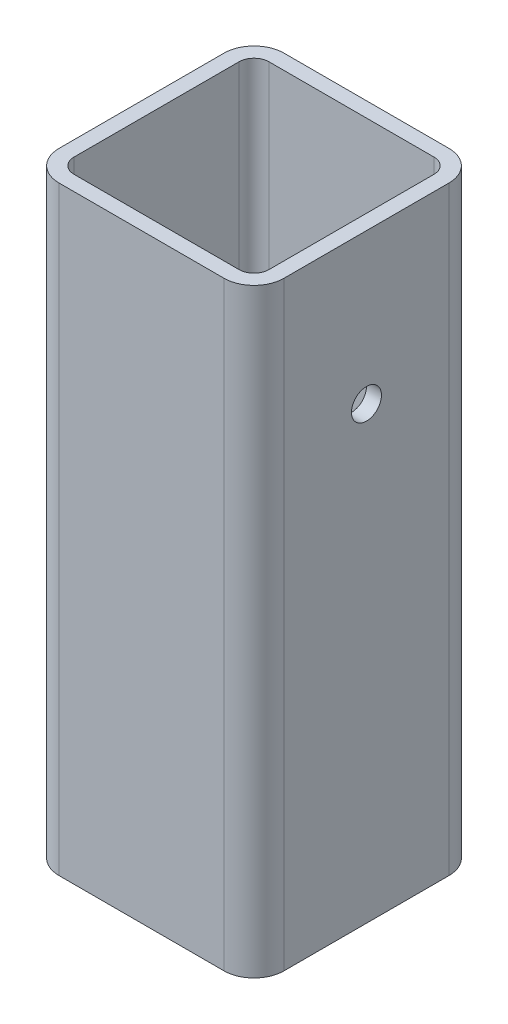
ISO-10303-21;
HEADER;
FILE_DESCRIPTION(('STEP AP214'),'2;1');
FILE_NAME('part.step','',(''),(''),'','','');
FILE_SCHEMA(('AUTOMOTIVE_DESIGN { 1 0 10303 214 1 1 1 1 }'));
ENDSEC;
DATA;
#1=APPLICATION_CONTEXT('core data for automotive mechanical design processes');
#2=APPLICATION_PROTOCOL_DEFINITION('international standard','automotive_design',2000,#1);
#3=PRODUCT_CONTEXT('',#1,'mechanical');
#4=PRODUCT('Part','Part','',(#3));
#5=PRODUCT_RELATED_PRODUCT_CATEGORY('part','',(#4));
#6=PRODUCT_DEFINITION_FORMATION('','',#4);
#7=PRODUCT_DEFINITION_CONTEXT('part definition',#1,'design');
#8=PRODUCT_DEFINITION('design','',#6,#7);
#9=PRODUCT_DEFINITION_SHAPE('','',#8);
#10=(LENGTH_UNIT() NAMED_UNIT(*) SI_UNIT(.MILLI.,.METRE.));
#11=(NAMED_UNIT(*) PLANE_ANGLE_UNIT() SI_UNIT($,.RADIAN.));
#12=(NAMED_UNIT(*) SI_UNIT($,.STERADIAN.) SOLID_ANGLE_UNIT());
#13=UNCERTAINTY_MEASURE_WITH_UNIT(LENGTH_MEASURE(1.E-05),#10,'distance_accuracy_value','');
#14=(GEOMETRIC_REPRESENTATION_CONTEXT(3) GLOBAL_UNCERTAINTY_ASSIGNED_CONTEXT((#13)) GLOBAL_UNIT_ASSIGNED_CONTEXT((#10,
#11,#12)) REPRESENTATION_CONTEXT('',''));
#15=CARTESIAN_POINT('',(0.,0.,0.));
#16=DIRECTION('',(0.,0.,1.));
#17=DIRECTION('',(1.,0.,0.));
#18=AXIS2_PLACEMENT_3D('',#15,#16,#17);
#19=CARTESIAN_POINT('',(-11.,40.,11.));
#20=DIRECTION('',(0.,-1.,0.));
#21=DIRECTION('',(0.,0.,-1.));
#22=AXIS2_PLACEMENT_3D('',#19,#20,#21);
#23=PLANE('',#22);
#24=CARTESIAN_POINT('',(-11.,40.,11.));
#25=DIRECTION('',(0.,1.,0.));
#26=DIRECTION('',(0.,0.,-1.));
#27=AXIS2_PLACEMENT_3D('',#24,#25,#26);
#28=CIRCLE('',#27,4.);
#29=CARTESIAN_POINT('',(-15.,40.,11.));
#30=VERTEX_POINT('',#29);
#31=CARTESIAN_POINT('',(-11.,40.,15.));
#32=VERTEX_POINT('',#31);
#33=EDGE_CURVE('E216',#30,#32,#28,.T.);
#34=ORIENTED_EDGE('',*,*,#33,.T.);
#35=DIRECTION('',(1.,0.,0.));
#36=VECTOR('',#35,1.);
#37=CARTESIAN_POINT('',(-11.,40.,15.));
#38=LINE('',#37,#36);
#39=CARTESIAN_POINT('',(11.,40.,15.));
#40=VERTEX_POINT('',#39);
#41=EDGE_CURVE('E219',#32,#40,#38,.T.);
#42=ORIENTED_EDGE('',*,*,#41,.T.);
#43=CARTESIAN_POINT('',(11.,40.,11.));
#44=DIRECTION('',(0.,1.,0.));
#45=DIRECTION('',(0.,0.,1.));
#46=AXIS2_PLACEMENT_3D('',#43,#44,#45);
#47=CIRCLE('',#46,4.);
#48=CARTESIAN_POINT('',(15.,40.,11.));
#49=VERTEX_POINT('',#48);
#50=EDGE_CURVE('E222',#40,#49,#47,.T.);
#51=ORIENTED_EDGE('',*,*,#50,.T.);
#52=DIRECTION('',(0.,0.,-1.));
#53=VECTOR('',#52,1.);
#54=CARTESIAN_POINT('',(15.,40.,11.));
#55=LINE('',#54,#53);
#56=CARTESIAN_POINT('',(15.,40.,-11.));
#57=VERTEX_POINT('',#56);
#58=EDGE_CURVE('E224',#49,#57,#55,.T.);
#59=ORIENTED_EDGE('',*,*,#58,.T.);
#60=CARTESIAN_POINT('',(11.,40.,-11.));
#61=DIRECTION('',(0.,1.,0.));
#62=DIRECTION('',(0.,0.,-1.));
#63=AXIS2_PLACEMENT_3D('',#60,#61,#62);
#64=CIRCLE('',#63,4.);
#65=CARTESIAN_POINT('',(11.,40.,-15.));
#66=VERTEX_POINT('',#65);
#67=EDGE_CURVE('E226',#57,#66,#64,.T.);
#68=ORIENTED_EDGE('',*,*,#67,.T.);
#69=DIRECTION('',(-1.,0.,0.));
#70=VECTOR('',#69,1.);
#71=CARTESIAN_POINT('',(-11.,40.,-15.));
#72=LINE('',#71,#70);
#73=CARTESIAN_POINT('',(-11.,40.,-15.));
#74=VERTEX_POINT('',#73);
#75=EDGE_CURVE('E228',#66,#74,#72,.T.);
#76=ORIENTED_EDGE('',*,*,#75,.T.);
#77=CARTESIAN_POINT('',(-11.,40.,-11.));
#78=DIRECTION('',(0.,1.,0.));
#79=DIRECTION('',(0.,0.,-1.));
#80=AXIS2_PLACEMENT_3D('',#77,#78,#79);
#81=CIRCLE('',#80,4.);
#82=CARTESIAN_POINT('',(-15.,40.,-11.));
#83=VERTEX_POINT('',#82);
#84=EDGE_CURVE('E230',#74,#83,#81,.T.);
#85=ORIENTED_EDGE('',*,*,#84,.T.);
#86=DIRECTION('',(0.,0.,1.));
#87=VECTOR('',#86,1.);
#88=CARTESIAN_POINT('',(-15.,40.,11.));
#89=LINE('',#88,#87);
#90=EDGE_CURVE('E232',#83,#30,#89,.T.);
#91=ORIENTED_EDGE('',*,*,#90,.T.);
#92=EDGE_LOOP('',(#34,#42,#51,#59,#68,#76,#85,#91));
#93=FACE_BOUND('',#92,.T.);
#94=CARTESIAN_POINT('',(-11.,40.,11.));
#95=DIRECTION('',(0.,1.,0.));
#96=DIRECTION('',(0.,0.,-1.));
#97=AXIS2_PLACEMENT_3D('',#94,#95,#96);
#98=CIRCLE('',#97,2.);
#99=CARTESIAN_POINT('',(-13.,40.,11.));
#100=VERTEX_POINT('',#99);
#101=CARTESIAN_POINT('',(-11.,40.,13.));
#102=VERTEX_POINT('',#101);
#103=EDGE_CURVE('E149',#100,#102,#98,.T.);
#104=ORIENTED_EDGE('',*,*,#103,.F.);
#105=DIRECTION('',(0.,0.,1.));
#106=VECTOR('',#105,1.);
#107=CARTESIAN_POINT('',(-13.,40.,11.));
#108=LINE('',#107,#106);
#109=CARTESIAN_POINT('',(-13.,40.,-11.));
#110=VERTEX_POINT('',#109);
#111=EDGE_CURVE('E183',#110,#100,#108,.T.);
#112=ORIENTED_EDGE('',*,*,#111,.F.);
#113=CARTESIAN_POINT('',(-11.,40.,-11.));
#114=DIRECTION('',(0.,1.,0.));
#115=DIRECTION('',(0.,0.,-1.));
#116=AXIS2_PLACEMENT_3D('',#113,#114,#115);
#117=CIRCLE('',#116,2.);
#118=CARTESIAN_POINT('',(-11.,40.,-13.));
#119=VERTEX_POINT('',#118);
#120=EDGE_CURVE('E181',#119,#110,#117,.T.);
#121=ORIENTED_EDGE('',*,*,#120,.F.);
#122=DIRECTION('',(-1.,0.,0.));
#123=VECTOR('',#122,1.);
#124=CARTESIAN_POINT('',(-11.,40.,-13.));
#125=LINE('',#124,#123);
#126=CARTESIAN_POINT('',(11.,40.,-13.));
#127=VERTEX_POINT('',#126);
#128=EDGE_CURVE('E179',#127,#119,#125,.T.);
#129=ORIENTED_EDGE('',*,*,#128,.F.);
#130=CARTESIAN_POINT('',(11.,40.,-11.));
#131=DIRECTION('',(0.,1.,0.));
#132=DIRECTION('',(0.,0.,-1.));
#133=AXIS2_PLACEMENT_3D('',#130,#131,#132);
#134=CIRCLE('',#133,2.);
#135=CARTESIAN_POINT('',(13.,40.,-11.));
#136=VERTEX_POINT('',#135);
#137=EDGE_CURVE('E177',#136,#127,#134,.T.);
#138=ORIENTED_EDGE('',*,*,#137,.F.);
#139=DIRECTION('',(0.,0.,-1.));
#140=VECTOR('',#139,1.);
#141=CARTESIAN_POINT('',(13.,40.,11.));
#142=LINE('',#141,#140);
#143=CARTESIAN_POINT('',(13.,40.,11.));
#144=VERTEX_POINT('',#143);
#145=EDGE_CURVE('E172',#144,#136,#142,.T.);
#146=ORIENTED_EDGE('',*,*,#145,.F.);
#147=CARTESIAN_POINT('',(11.,40.,11.));
#148=DIRECTION('',(0.,1.,0.));
#149=DIRECTION('',(0.,0.,1.));
#150=AXIS2_PLACEMENT_3D('',#147,#148,#149);
#151=CIRCLE('',#150,2.);
#152=CARTESIAN_POINT('',(11.,40.,13.));
#153=VERTEX_POINT('',#152);
#154=EDGE_CURVE('E170',#153,#144,#151,.T.);
#155=ORIENTED_EDGE('',*,*,#154,.F.);
#156=DIRECTION('',(1.,0.,0.));
#157=VECTOR('',#156,1.);
#158=CARTESIAN_POINT('',(-11.,40.,13.));
#159=LINE('',#158,#157);
#160=EDGE_CURVE('E157',#102,#153,#159,.T.);
#161=ORIENTED_EDGE('',*,*,#160,.F.);
#162=EDGE_LOOP('',(#104,#112,#121,#129,#138,#146,#155,#161));
#163=FACE_BOUND('',#162,.T.);
#164=ADVANCED_FACE('F35',(#93,#163),#23,.F.);
#165=CARTESIAN_POINT('',(-11.,-40.,11.));
#166=DIRECTION('',(0.,-1.,0.));
#167=DIRECTION('',(0.,0.,-1.));
#168=AXIS2_PLACEMENT_3D('',#165,#166,#167);
#169=PLANE('',#168);
#170=CARTESIAN_POINT('',(-11.,-40.,11.));
#171=DIRECTION('',(0.,1.,0.));
#172=DIRECTION('',(0.,0.,-1.));
#173=AXIS2_PLACEMENT_3D('',#170,#171,#172);
#174=CIRCLE('',#173,4.);
#175=CARTESIAN_POINT('',(-15.,-40.,11.));
#176=VERTEX_POINT('',#175);
#177=CARTESIAN_POINT('',(-11.,-40.,15.));
#178=VERTEX_POINT('',#177);
#179=EDGE_CURVE('E165',#176,#178,#174,.T.);
#180=ORIENTED_EDGE('',*,*,#179,.F.);
#181=DIRECTION('',(0.,0.,1.));
#182=VECTOR('',#181,1.);
#183=CARTESIAN_POINT('',(-15.,-40.,11.));
#184=LINE('',#183,#182);
#185=CARTESIAN_POINT('',(-15.,-40.,-11.));
#186=VERTEX_POINT('',#185);
#187=EDGE_CURVE('E220',#186,#176,#184,.T.);
#188=ORIENTED_EDGE('',*,*,#187,.F.);
#189=CARTESIAN_POINT('',(-11.,-40.,-11.));
#190=DIRECTION('',(0.,1.,0.));
#191=DIRECTION('',(0.,0.,-1.));
#192=AXIS2_PLACEMENT_3D('',#189,#190,#191);
#193=CIRCLE('',#192,4.);
#194=CARTESIAN_POINT('',(-11.,-40.,-15.));
#195=VERTEX_POINT('',#194);
#196=EDGE_CURVE('E247',#195,#186,#193,.T.);
#197=ORIENTED_EDGE('',*,*,#196,.F.);
#198=DIRECTION('',(-1.,0.,0.));
#199=VECTOR('',#198,1.);
#200=CARTESIAN_POINT('',(-11.,-40.,-15.));
#201=LINE('',#200,#199);
#202=CARTESIAN_POINT('',(11.,-40.,-15.));
#203=VERTEX_POINT('',#202);
#204=EDGE_CURVE('E245',#203,#195,#201,.T.);
#205=ORIENTED_EDGE('',*,*,#204,.F.);
#206=CARTESIAN_POINT('',(11.,-40.,-11.));
#207=DIRECTION('',(0.,1.,0.));
#208=DIRECTION('',(0.,0.,-1.));
#209=AXIS2_PLACEMENT_3D('',#206,#207,#208);
#210=CIRCLE('',#209,4.);
#211=CARTESIAN_POINT('',(15.,-40.,-11.));
#212=VERTEX_POINT('',#211);
#213=EDGE_CURVE('E243',#212,#203,#210,.T.);
#214=ORIENTED_EDGE('',*,*,#213,.F.);
#215=DIRECTION('',(0.,0.,-1.));
#216=VECTOR('',#215,1.);
#217=CARTESIAN_POINT('',(15.,-40.,11.));
#218=LINE('',#217,#216);
#219=CARTESIAN_POINT('',(15.,-40.,11.));
#220=VERTEX_POINT('',#219);
#221=EDGE_CURVE('E241',#220,#212,#218,.T.);
#222=ORIENTED_EDGE('',*,*,#221,.F.);
#223=CARTESIAN_POINT('',(11.,-40.,11.));
#224=DIRECTION('',(0.,1.,0.));
#225=DIRECTION('',(0.,0.,1.));
#226=AXIS2_PLACEMENT_3D('',#223,#224,#225);
#227=CIRCLE('',#226,4.);
#228=CARTESIAN_POINT('',(11.,-40.,15.));
#229=VERTEX_POINT('',#228);
#230=EDGE_CURVE('E239',#229,#220,#227,.T.);
#231=ORIENTED_EDGE('',*,*,#230,.F.);
#232=DIRECTION('',(1.,0.,0.));
#233=VECTOR('',#232,1.);
#234=CARTESIAN_POINT('',(-11.,-40.,15.));
#235=LINE('',#234,#233);
#236=EDGE_CURVE('E237',#178,#229,#235,.T.);
#237=ORIENTED_EDGE('',*,*,#236,.F.);
#238=EDGE_LOOP('',(#180,#188,#197,#205,#214,#222,#231,#237));
#239=FACE_BOUND('',#238,.T.);
#240=DIRECTION('',(0.,0.,1.));
#241=VECTOR('',#240,1.);
#242=CARTESIAN_POINT('',(-13.,-40.,11.));
#243=LINE('',#242,#241);
#244=CARTESIAN_POINT('',(-13.,-40.,-11.));
#245=VERTEX_POINT('',#244);
#246=CARTESIAN_POINT('',(-13.,-40.,11.));
#247=VERTEX_POINT('',#246);
#248=EDGE_CURVE('E158',#245,#247,#243,.T.);
#249=ORIENTED_EDGE('',*,*,#248,.T.);
#250=CARTESIAN_POINT('',(-11.,-40.,11.));
#251=DIRECTION('',(0.,1.,0.));
#252=DIRECTION('',(0.,0.,-1.));
#253=AXIS2_PLACEMENT_3D('',#250,#251,#252);
#254=CIRCLE('',#253,2.);
#255=CARTESIAN_POINT('',(-11.,-40.,13.));
#256=VERTEX_POINT('',#255);
#257=EDGE_CURVE('E59',#247,#256,#254,.T.);
#258=ORIENTED_EDGE('',*,*,#257,.T.);
#259=DIRECTION('',(1.,0.,0.));
#260=VECTOR('',#259,1.);
#261=CARTESIAN_POINT('',(-11.,-40.,13.));
#262=LINE('',#261,#260);
#263=CARTESIAN_POINT('',(11.,-40.,13.));
#264=VERTEX_POINT('',#263);
#265=EDGE_CURVE('E164',#256,#264,#262,.T.);
#266=ORIENTED_EDGE('',*,*,#265,.T.);
#267=CARTESIAN_POINT('',(11.,-40.,11.));
#268=DIRECTION('',(0.,1.,0.));
#269=DIRECTION('',(0.,0.,1.));
#270=AXIS2_PLACEMENT_3D('',#267,#268,#269);
#271=CIRCLE('',#270,2.);
#272=CARTESIAN_POINT('',(13.,-40.,11.));
#273=VERTEX_POINT('',#272);
#274=EDGE_CURVE('E188',#264,#273,#271,.T.);
#275=ORIENTED_EDGE('',*,*,#274,.T.);
#276=DIRECTION('',(0.,0.,-1.));
#277=VECTOR('',#276,1.);
#278=CARTESIAN_POINT('',(13.,-40.,11.));
#279=LINE('',#278,#277);
#280=CARTESIAN_POINT('',(13.,-40.,-11.));
#281=VERTEX_POINT('',#280);
#282=EDGE_CURVE('E191',#273,#281,#279,.T.);
#283=ORIENTED_EDGE('',*,*,#282,.T.);
#284=CARTESIAN_POINT('',(11.,-40.,-11.));
#285=DIRECTION('',(0.,1.,0.));
#286=DIRECTION('',(0.,0.,-1.));
#287=AXIS2_PLACEMENT_3D('',#284,#285,#286);
#288=CIRCLE('',#287,2.);
#289=CARTESIAN_POINT('',(11.,-40.,-13.));
#290=VERTEX_POINT('',#289);
#291=EDGE_CURVE('E194',#281,#290,#288,.T.);
#292=ORIENTED_EDGE('',*,*,#291,.T.);
#293=DIRECTION('',(-1.,0.,0.));
#294=VECTOR('',#293,1.);
#295=CARTESIAN_POINT('',(-11.,-40.,-13.));
#296=LINE('',#295,#294);
#297=CARTESIAN_POINT('',(-11.,-40.,-13.));
#298=VERTEX_POINT('',#297);
#299=EDGE_CURVE('E197',#290,#298,#296,.T.);
#300=ORIENTED_EDGE('',*,*,#299,.T.);
#301=CARTESIAN_POINT('',(-11.,-40.,-11.));
#302=DIRECTION('',(0.,1.,0.));
#303=DIRECTION('',(0.,0.,-1.));
#304=AXIS2_PLACEMENT_3D('',#301,#302,#303);
#305=CIRCLE('',#304,2.);
#306=EDGE_CURVE('E200',#298,#245,#305,.T.);
#307=ORIENTED_EDGE('',*,*,#306,.T.);
#308=EDGE_LOOP('',(#249,#258,#266,#275,#283,#292,#300,#307));
#309=FACE_BOUND('',#308,.T.);
#310=ADVANCED_FACE('F278',(#239,#309),#169,.T.);
#311=CARTESIAN_POINT('',(-11.,40.,11.));
#312=DIRECTION('',(0.,-1.,0.));
#313=DIRECTION('',(0.,0.,-1.));
#314=AXIS2_PLACEMENT_3D('',#311,#312,#313);
#315=CYLINDRICAL_SURFACE('',#314,4.);
#316=ORIENTED_EDGE('',*,*,#179,.T.);
#317=DIRECTION('',(0.,-1.,0.));
#318=VECTOR('',#317,1.);
#319=CARTESIAN_POINT('',(-11.,40.,15.));
#320=LINE('',#319,#318);
#321=EDGE_CURVE('E11',#32,#178,#320,.T.);
#322=ORIENTED_EDGE('',*,*,#321,.F.);
#323=ORIENTED_EDGE('',*,*,#33,.F.);
#324=DIRECTION('',(0.,-1.,0.));
#325=VECTOR('',#324,1.);
#326=CARTESIAN_POINT('',(-15.,40.,11.));
#327=LINE('',#326,#325);
#328=EDGE_CURVE('E234',#30,#176,#327,.T.);
#329=ORIENTED_EDGE('',*,*,#328,.T.);
#330=EDGE_LOOP('',(#316,#322,#323,#329));
#331=FACE_BOUND('',#330,.T.);
#332=ADVANCED_FACE('F37',(#331),#315,.T.);
#333=CARTESIAN_POINT('',(-11.,40.,15.));
#334=DIRECTION('',(0.,0.,-1.));
#335=DIRECTION('',(-1.,0.,0.));
#336=AXIS2_PLACEMENT_3D('',#333,#334,#335);
#337=PLANE('',#336);
#338=ORIENTED_EDGE('',*,*,#236,.T.);
#339=DIRECTION('',(0.,-1.,0.));
#340=VECTOR('',#339,1.);
#341=CARTESIAN_POINT('',(11.,40.,15.));
#342=LINE('',#341,#340);
#343=EDGE_CURVE('E44',#40,#229,#342,.T.);
#344=ORIENTED_EDGE('',*,*,#343,.F.);
#345=ORIENTED_EDGE('',*,*,#41,.F.);
#346=ORIENTED_EDGE('',*,*,#321,.T.);
#347=EDGE_LOOP('',(#338,#344,#345,#346));
#348=FACE_BOUND('',#347,.T.);
#349=ADVANCED_FACE('F295',(#348),#337,.F.);
#350=CARTESIAN_POINT('',(11.,40.,11.));
#351=DIRECTION('',(0.,-1.,0.));
#352=DIRECTION('',(0.,0.,-1.));
#353=AXIS2_PLACEMENT_3D('',#350,#351,#352);
#354=CYLINDRICAL_SURFACE('',#353,4.);
#355=ORIENTED_EDGE('',*,*,#230,.T.);
#356=DIRECTION('',(0.,-1.,0.));
#357=VECTOR('',#356,1.);
#358=CARTESIAN_POINT('',(15.,40.,11.));
#359=LINE('',#358,#357);
#360=EDGE_CURVE('E264',#49,#220,#359,.T.);
#361=ORIENTED_EDGE('',*,*,#360,.F.);
#362=ORIENTED_EDGE('',*,*,#50,.F.);
#363=ORIENTED_EDGE('',*,*,#343,.T.);
#364=EDGE_LOOP('',(#355,#361,#362,#363));
#365=FACE_BOUND('',#364,.T.);
#366=ADVANCED_FACE('F272',(#365),#354,.T.);
#367=CARTESIAN_POINT('',(15.,40.,11.));
#368=DIRECTION('',(-1.,0.,0.));
#369=DIRECTION('',(0.,0.,1.));
#370=AXIS2_PLACEMENT_3D('',#367,#368,#369);
#371=PLANE('',#370);
#372=CARTESIAN_POINT('',(15.,20.,0.));
#373=DIRECTION('',(1.,0.,0.));
#374=DIRECTION('',(0.,0.,-1.));
#375=AXIS2_PLACEMENT_3D('',#372,#373,#374);
#376=CIRCLE('',#375,2.);
#377=CARTESIAN_POINT('',(15.,20.,-2.));
#378=VERTEX_POINT('',#377);
#379=EDGE_CURVE('E335',#378,#378,#376,.T.);
#380=ORIENTED_EDGE('',*,*,#379,.F.);
#381=EDGE_LOOP('',(#380));
#382=FACE_BOUND('',#381,.T.);
#383=ORIENTED_EDGE('',*,*,#221,.T.);
#384=DIRECTION('',(0.,-1.,0.));
#385=VECTOR('',#384,1.);
#386=CARTESIAN_POINT('',(15.,40.,-11.));
#387=LINE('',#386,#385);
#388=EDGE_CURVE('E261',#57,#212,#387,.T.);
#389=ORIENTED_EDGE('',*,*,#388,.F.);
#390=ORIENTED_EDGE('',*,*,#58,.F.);
#391=ORIENTED_EDGE('',*,*,#360,.T.);
#392=EDGE_LOOP('',(#383,#389,#390,#391));
#393=FACE_BOUND('',#392,.T.);
#394=ADVANCED_FACE('F284',(#382,#393),#371,.F.);
#395=CARTESIAN_POINT('',(11.,40.,-11.));
#396=DIRECTION('',(0.,-1.,0.));
#397=DIRECTION('',(0.,0.,-1.));
#398=AXIS2_PLACEMENT_3D('',#395,#396,#397);
#399=CYLINDRICAL_SURFACE('',#398,4.);
#400=ORIENTED_EDGE('',*,*,#213,.T.);
#401=DIRECTION('',(0.,-1.,0.));
#402=VECTOR('',#401,1.);
#403=CARTESIAN_POINT('',(11.,40.,-15.));
#404=LINE('',#403,#402);
#405=EDGE_CURVE('E258',#66,#203,#404,.T.);
#406=ORIENTED_EDGE('',*,*,#405,.F.);
#407=ORIENTED_EDGE('',*,*,#67,.F.);
#408=ORIENTED_EDGE('',*,*,#388,.T.);
#409=EDGE_LOOP('',(#400,#406,#407,#408));
#410=FACE_BOUND('',#409,.T.);
#411=ADVANCED_FACE('F288',(#410),#399,.T.);
#412=CARTESIAN_POINT('',(-11.,40.,-15.));
#413=DIRECTION('',(0.,0.,1.));
#414=DIRECTION('',(1.,0.,0.));
#415=AXIS2_PLACEMENT_3D('',#412,#413,#414);
#416=PLANE('',#415);
#417=ORIENTED_EDGE('',*,*,#204,.T.);
#418=DIRECTION('',(0.,-1.,0.));
#419=VECTOR('',#418,1.);
#420=CARTESIAN_POINT('',(-11.,40.,-15.));
#421=LINE('',#420,#419);
#422=EDGE_CURVE('E255',#74,#195,#421,.T.);
#423=ORIENTED_EDGE('',*,*,#422,.F.);
#424=ORIENTED_EDGE('',*,*,#75,.F.);
#425=ORIENTED_EDGE('',*,*,#405,.T.);
#426=EDGE_LOOP('',(#417,#423,#424,#425));
#427=FACE_BOUND('',#426,.T.);
#428=ADVANCED_FACE('F308',(#427),#416,.F.);
#429=CARTESIAN_POINT('',(-11.,40.,-11.));
#430=DIRECTION('',(0.,-1.,0.));
#431=DIRECTION('',(0.,0.,-1.));
#432=AXIS2_PLACEMENT_3D('',#429,#430,#431);
#433=CYLINDRICAL_SURFACE('',#432,4.);
#434=ORIENTED_EDGE('',*,*,#196,.T.);
#435=DIRECTION('',(0.,-1.,0.));
#436=VECTOR('',#435,1.);
#437=CARTESIAN_POINT('',(-15.,40.,-11.));
#438=LINE('',#437,#436);
#439=EDGE_CURVE('E252',#83,#186,#438,.T.);
#440=ORIENTED_EDGE('',*,*,#439,.F.);
#441=ORIENTED_EDGE('',*,*,#84,.F.);
#442=ORIENTED_EDGE('',*,*,#422,.T.);
#443=EDGE_LOOP('',(#434,#440,#441,#442));
#444=FACE_BOUND('',#443,.T.);
#445=ADVANCED_FACE('F306',(#444),#433,.T.);
#446=CARTESIAN_POINT('',(-15.,40.,11.));
#447=DIRECTION('',(1.,0.,0.));
#448=DIRECTION('',(0.,0.,-1.));
#449=AXIS2_PLACEMENT_3D('',#446,#447,#448);
#450=PLANE('',#449);
#451=CARTESIAN_POINT('',(-15.,20.,0.));
#452=DIRECTION('',(1.,0.,0.));
#453=DIRECTION('',(0.,0.,-1.));
#454=AXIS2_PLACEMENT_3D('',#451,#452,#453);
#455=CIRCLE('',#454,2.);
#456=CARTESIAN_POINT('',(-15.,20.,-2.));
#457=VERTEX_POINT('',#456);
#458=EDGE_CURVE('E333',#457,#457,#455,.T.);
#459=ORIENTED_EDGE('',*,*,#458,.T.);
#460=EDGE_LOOP('',(#459));
#461=FACE_BOUND('',#460,.T.);
#462=ORIENTED_EDGE('',*,*,#187,.T.);
#463=ORIENTED_EDGE('',*,*,#328,.F.);
#464=ORIENTED_EDGE('',*,*,#90,.F.);
#465=ORIENTED_EDGE('',*,*,#439,.T.);
#466=EDGE_LOOP('',(#462,#463,#464,#465));
#467=FACE_BOUND('',#466,.T.);
#468=ADVANCED_FACE('F301',(#461,#467),#450,.F.);
#469=CARTESIAN_POINT('',(-11.,40.,11.));
#470=DIRECTION('',(0.,-1.,0.));
#471=DIRECTION('',(0.,0.,-1.));
#472=AXIS2_PLACEMENT_3D('',#469,#470,#471);
#473=CYLINDRICAL_SURFACE('',#472,2.);
#474=ORIENTED_EDGE('',*,*,#257,.F.);
#475=DIRECTION('',(0.,-1.,0.));
#476=VECTOR('',#475,1.);
#477=CARTESIAN_POINT('',(-13.,40.,11.));
#478=LINE('',#477,#476);
#479=EDGE_CURVE('E153',#100,#247,#478,.T.);
#480=ORIENTED_EDGE('',*,*,#479,.F.);
#481=ORIENTED_EDGE('',*,*,#103,.T.);
#482=DIRECTION('',(0.,-1.,0.));
#483=VECTOR('',#482,1.);
#484=CARTESIAN_POINT('',(-11.,40.,13.));
#485=LINE('',#484,#483);
#486=EDGE_CURVE('E152',#102,#256,#485,.T.);
#487=ORIENTED_EDGE('',*,*,#486,.T.);
#488=EDGE_LOOP('',(#474,#480,#481,#487));
#489=FACE_BOUND('',#488,.T.);
#490=ADVANCED_FACE('F151',(#489),#473,.F.);
#491=CARTESIAN_POINT('',(-11.,40.,13.));
#492=DIRECTION('',(0.,0.,-1.));
#493=DIRECTION('',(-1.,0.,0.));
#494=AXIS2_PLACEMENT_3D('',#491,#492,#493);
#495=PLANE('',#494);
#496=ORIENTED_EDGE('',*,*,#265,.F.);
#497=ORIENTED_EDGE('',*,*,#486,.F.);
#498=ORIENTED_EDGE('',*,*,#160,.T.);
#499=DIRECTION('',(0.,-1.,0.));
#500=VECTOR('',#499,1.);
#501=CARTESIAN_POINT('',(11.,40.,13.));
#502=LINE('',#501,#500);
#503=EDGE_CURVE('E166',#153,#264,#502,.T.);
#504=ORIENTED_EDGE('',*,*,#503,.T.);
#505=EDGE_LOOP('',(#496,#497,#498,#504));
#506=FACE_BOUND('',#505,.T.);
#507=ADVANCED_FACE('F161',(#506),#495,.T.);
#508=CARTESIAN_POINT('',(11.,40.,11.));
#509=DIRECTION('',(0.,-1.,0.));
#510=DIRECTION('',(0.,0.,-1.));
#511=AXIS2_PLACEMENT_3D('',#508,#509,#510);
#512=CYLINDRICAL_SURFACE('',#511,2.);
#513=ORIENTED_EDGE('',*,*,#274,.F.);
#514=ORIENTED_EDGE('',*,*,#503,.F.);
#515=ORIENTED_EDGE('',*,*,#154,.T.);
#516=DIRECTION('',(0.,-1.,0.));
#517=VECTOR('',#516,1.);
#518=CARTESIAN_POINT('',(13.,40.,11.));
#519=LINE('',#518,#517);
#520=EDGE_CURVE('E213',#144,#273,#519,.T.);
#521=ORIENTED_EDGE('',*,*,#520,.T.);
#522=EDGE_LOOP('',(#513,#514,#515,#521));
#523=FACE_BOUND('',#522,.T.);
#524=ADVANCED_FACE('F350',(#523),#512,.F.);
#525=CARTESIAN_POINT('',(13.,40.,11.));
#526=DIRECTION('',(-1.,0.,0.));
#527=DIRECTION('',(0.,0.,1.));
#528=AXIS2_PLACEMENT_3D('',#525,#526,#527);
#529=PLANE('',#528);
#530=CARTESIAN_POINT('',(13.,20.,0.));
#531=DIRECTION('',(-1.,0.,0.));
#532=DIRECTION('',(0.,0.,1.));
#533=AXIS2_PLACEMENT_3D('',#530,#531,#532);
#534=CIRCLE('',#533,2.);
#535=CARTESIAN_POINT('',(13.,20.,2.));
#536=VERTEX_POINT('',#535);
#537=EDGE_CURVE('E186',#536,#536,#534,.T.);
#538=ORIENTED_EDGE('',*,*,#537,.F.);
#539=EDGE_LOOP('',(#538));
#540=FACE_BOUND('',#539,.T.);
#541=ORIENTED_EDGE('',*,*,#282,.F.);
#542=ORIENTED_EDGE('',*,*,#520,.F.);
#543=ORIENTED_EDGE('',*,*,#145,.T.);
#544=DIRECTION('',(0.,-1.,0.));
#545=VECTOR('',#544,1.);
#546=CARTESIAN_POINT('',(13.,40.,-11.));
#547=LINE('',#546,#545);
#548=EDGE_CURVE('E211',#136,#281,#547,.T.);
#549=ORIENTED_EDGE('',*,*,#548,.T.);
#550=EDGE_LOOP('',(#541,#542,#543,#549));
#551=FACE_BOUND('',#550,.T.);
#552=ADVANCED_FACE('F346',(#540,#551),#529,.T.);
#553=CARTESIAN_POINT('',(11.,40.,-11.));
#554=DIRECTION('',(0.,-1.,0.));
#555=DIRECTION('',(0.,0.,-1.));
#556=AXIS2_PLACEMENT_3D('',#553,#554,#555);
#557=CYLINDRICAL_SURFACE('',#556,2.);
#558=ORIENTED_EDGE('',*,*,#291,.F.);
#559=ORIENTED_EDGE('',*,*,#548,.F.);
#560=ORIENTED_EDGE('',*,*,#137,.T.);
#561=DIRECTION('',(0.,-1.,0.));
#562=VECTOR('',#561,1.);
#563=CARTESIAN_POINT('',(11.,40.,-13.));
#564=LINE('',#563,#562);
#565=EDGE_CURVE('E209',#127,#290,#564,.T.);
#566=ORIENTED_EDGE('',*,*,#565,.T.);
#567=EDGE_LOOP('',(#558,#559,#560,#566));
#568=FACE_BOUND('',#567,.T.);
#569=ADVANCED_FACE('F349',(#568),#557,.F.);
#570=CARTESIAN_POINT('',(-11.,40.,-13.));
#571=DIRECTION('',(0.,0.,1.));
#572=DIRECTION('',(1.,0.,0.));
#573=AXIS2_PLACEMENT_3D('',#570,#571,#572);
#574=PLANE('',#573);
#575=ORIENTED_EDGE('',*,*,#299,.F.);
#576=ORIENTED_EDGE('',*,*,#565,.F.);
#577=ORIENTED_EDGE('',*,*,#128,.T.);
#578=DIRECTION('',(0.,-1.,0.));
#579=VECTOR('',#578,1.);
#580=CARTESIAN_POINT('',(-11.,40.,-13.));
#581=LINE('',#580,#579);
#582=EDGE_CURVE('E207',#119,#298,#581,.T.);
#583=ORIENTED_EDGE('',*,*,#582,.T.);
#584=EDGE_LOOP('',(#575,#576,#577,#583));
#585=FACE_BOUND('',#584,.T.);
#586=ADVANCED_FACE('F366',(#585),#574,.T.);
#587=CARTESIAN_POINT('',(-11.,40.,-11.));
#588=DIRECTION('',(0.,-1.,0.));
#589=DIRECTION('',(0.,0.,-1.));
#590=AXIS2_PLACEMENT_3D('',#587,#588,#589);
#591=CYLINDRICAL_SURFACE('',#590,2.);
#592=ORIENTED_EDGE('',*,*,#306,.F.);
#593=ORIENTED_EDGE('',*,*,#582,.F.);
#594=ORIENTED_EDGE('',*,*,#120,.T.);
#595=DIRECTION('',(0.,-1.,0.));
#596=VECTOR('',#595,1.);
#597=CARTESIAN_POINT('',(-13.,40.,-11.));
#598=LINE('',#597,#596);
#599=EDGE_CURVE('E51',#110,#245,#598,.T.);
#600=ORIENTED_EDGE('',*,*,#599,.T.);
#601=EDGE_LOOP('',(#592,#593,#594,#600));
#602=FACE_BOUND('',#601,.T.);
#603=ADVANCED_FACE('F370',(#602),#591,.F.);
#604=CARTESIAN_POINT('',(-13.,40.,11.));
#605=DIRECTION('',(1.,0.,0.));
#606=DIRECTION('',(0.,0.,-1.));
#607=AXIS2_PLACEMENT_3D('',#604,#605,#606);
#608=PLANE('',#607);
#609=CARTESIAN_POINT('',(-13.,20.,0.));
#610=DIRECTION('',(1.,0.,0.));
#611=DIRECTION('',(0.,0.,-1.));
#612=AXIS2_PLACEMENT_3D('',#609,#610,#611);
#613=CIRCLE('',#612,2.);
#614=CARTESIAN_POINT('',(-13.,20.,-2.));
#615=VERTEX_POINT('',#614);
#616=EDGE_CURVE('E39',#615,#615,#613,.T.);
#617=ORIENTED_EDGE('',*,*,#616,.F.);
#618=EDGE_LOOP('',(#617));
#619=FACE_BOUND('',#618,.T.);
#620=ORIENTED_EDGE('',*,*,#248,.F.);
#621=ORIENTED_EDGE('',*,*,#599,.F.);
#622=ORIENTED_EDGE('',*,*,#111,.T.);
#623=ORIENTED_EDGE('',*,*,#479,.T.);
#624=EDGE_LOOP('',(#620,#621,#622,#623));
#625=FACE_BOUND('',#624,.T.);
#626=ADVANCED_FACE('F374',(#619,#625),#608,.T.);
#627=CARTESIAN_POINT('',(-15.,20.,0.));
#628=DIRECTION('',(1.,0.,0.));
#629=DIRECTION('',(0.,0.,-1.));
#630=AXIS2_PLACEMENT_3D('',#627,#628,#629);
#631=CYLINDRICAL_SURFACE('',#630,2.);
#632=ORIENTED_EDGE('',*,*,#616,.T.);
#633=EDGE_LOOP('',(#632));
#634=FACE_BOUND('',#633,.T.);
#635=ORIENTED_EDGE('',*,*,#458,.F.);
#636=EDGE_LOOP('',(#635));
#637=FACE_BOUND('',#636,.T.);
#638=ADVANCED_FACE('F378',(#634,#637),#631,.F.);
#639=ORIENTED_EDGE('',*,*,#537,.T.);
#640=EDGE_LOOP('',(#639));
#641=FACE_BOUND('',#640,.T.);
#642=ORIENTED_EDGE('',*,*,#379,.T.);
#643=EDGE_LOOP('',(#642));
#644=FACE_BOUND('',#643,.T.);
#645=ADVANCED_FACE('F343',(#641,#644),#631,.F.);
#646=CLOSED_SHELL('',(#164,#310,#332,#349,#366,#394,#411,#428,#445,#468,#490,#507,#524,#552,
#569,#586,#603,#626,#638,#645));
#647=MANIFOLD_SOLID_BREP('B2',#646);
#648=ADVANCED_BREP_SHAPE_REPRESENTATION('',(#18,#647),#14);
#649=SHAPE_DEFINITION_REPRESENTATION(#9,#648);
ENDSEC;
END-ISO-10303-21;
